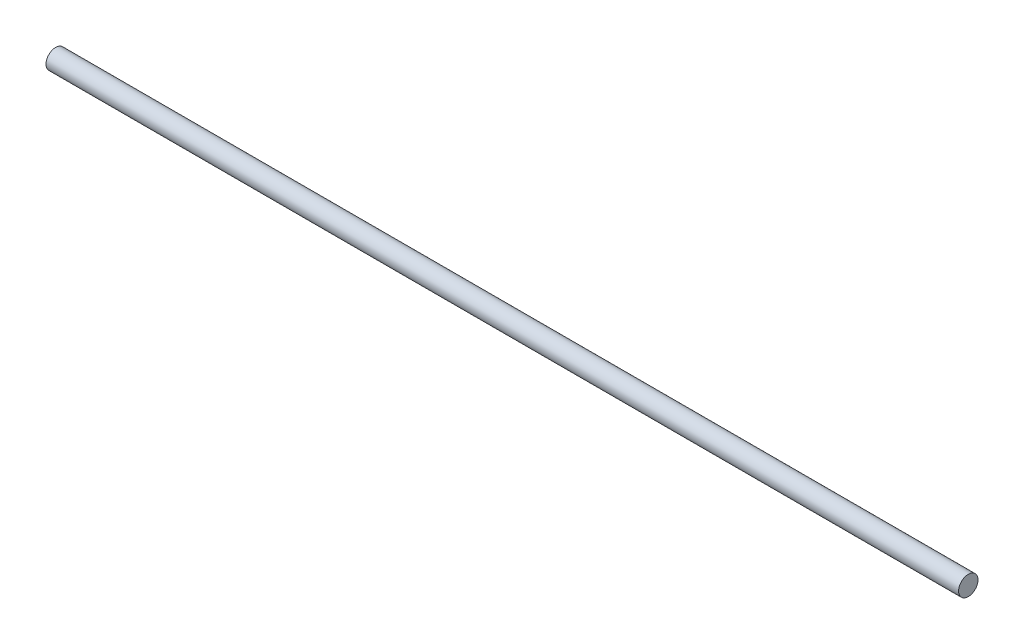
ISO-10303-21;
HEADER;
FILE_DESCRIPTION(('STEP AP214'),'2;1');
FILE_NAME('part.step','',(''),(''),'','','');
FILE_SCHEMA(('AUTOMOTIVE_DESIGN { 1 0 10303 214 1 1 1 1 }'));
ENDSEC;
DATA;
#1=APPLICATION_CONTEXT('core data for automotive mechanical design processes');
#2=APPLICATION_PROTOCOL_DEFINITION('international standard','automotive_design',2000,#1);
#3=PRODUCT_CONTEXT('',#1,'mechanical');
#4=PRODUCT('Part','Part','',(#3));
#5=PRODUCT_RELATED_PRODUCT_CATEGORY('part','',(#4));
#6=PRODUCT_DEFINITION_FORMATION('','',#4);
#7=PRODUCT_DEFINITION_CONTEXT('part definition',#1,'design');
#8=PRODUCT_DEFINITION('design','',#6,#7);
#9=PRODUCT_DEFINITION_SHAPE('','',#8);
#10=(LENGTH_UNIT() NAMED_UNIT(*) SI_UNIT(.MILLI.,.METRE.));
#11=(NAMED_UNIT(*) PLANE_ANGLE_UNIT() SI_UNIT($,.RADIAN.));
#12=(NAMED_UNIT(*) SI_UNIT($,.STERADIAN.) SOLID_ANGLE_UNIT());
#13=UNCERTAINTY_MEASURE_WITH_UNIT(LENGTH_MEASURE(1.E-05),#10,'distance_accuracy_value','');
#14=(GEOMETRIC_REPRESENTATION_CONTEXT(3) GLOBAL_UNCERTAINTY_ASSIGNED_CONTEXT((#13)) GLOBAL_UNIT_ASSIGNED_CONTEXT((#10,
#11,#12)) REPRESENTATION_CONTEXT('',''));
#15=CARTESIAN_POINT('',(0.,0.,0.));
#16=DIRECTION('',(0.,0.,1.));
#17=DIRECTION('',(1.,0.,0.));
#18=AXIS2_PLACEMENT_3D('',#15,#16,#17);
#19=CARTESIAN_POINT('',(596.9,0.,0.));
#20=DIRECTION('',(-1.,0.,0.));
#21=DIRECTION('',(0.,0.,1.));
#22=AXIS2_PLACEMENT_3D('',#19,#20,#21);
#23=CYLINDRICAL_SURFACE('',#22,6.35);
#24=CARTESIAN_POINT('',(596.9,0.,0.));
#25=DIRECTION('',(1.,0.,0.));
#26=DIRECTION('',(0.,0.,-1.));
#27=AXIS2_PLACEMENT_3D('',#24,#25,#26);
#28=CIRCLE('',#27,6.35);
#29=CARTESIAN_POINT('',(596.9,0.,-6.35));
#30=VERTEX_POINT('',#29);
#31=EDGE_CURVE('E10',#30,#30,#28,.T.);
#32=ORIENTED_EDGE('',*,*,#31,.F.);
#33=EDGE_LOOP('',(#32));
#34=FACE_BOUND('',#33,.T.);
#35=CARTESIAN_POINT('',(0.,0.,0.));
#36=DIRECTION('',(1.,0.,0.));
#37=DIRECTION('',(0.,0.,-1.));
#38=AXIS2_PLACEMENT_3D('',#35,#36,#37);
#39=CIRCLE('',#38,6.35);
#40=CARTESIAN_POINT('',(0.,0.,-6.35));
#41=VERTEX_POINT('',#40);
#42=EDGE_CURVE('E46',#41,#41,#39,.T.);
#43=ORIENTED_EDGE('',*,*,#42,.T.);
#44=EDGE_LOOP('',(#43));
#45=FACE_BOUND('',#44,.T.);
#46=ADVANCED_FACE('F43',(#34,#45),#23,.T.);
#47=CARTESIAN_POINT('',(596.9,0.,0.));
#48=DIRECTION('',(1.,0.,0.));
#49=DIRECTION('',(0.,0.,-1.));
#50=AXIS2_PLACEMENT_3D('',#47,#48,#49);
#51=PLANE('',#50);
#52=ORIENTED_EDGE('',*,*,#31,.T.);
#53=EDGE_LOOP('',(#52));
#54=FACE_BOUND('',#53,.T.);
#55=ADVANCED_FACE('F60',(#54),#51,.T.);
#56=CARTESIAN_POINT('',(0.,0.,0.));
#57=DIRECTION('',(1.,0.,0.));
#58=DIRECTION('',(0.,0.,-1.));
#59=AXIS2_PLACEMENT_3D('',#56,#57,#58);
#60=PLANE('',#59);
#61=ORIENTED_EDGE('',*,*,#42,.F.);
#62=EDGE_LOOP('',(#61));
#63=FACE_BOUND('',#62,.T.);
#64=ADVANCED_FACE('F58',(#63),#60,.F.);
#65=CLOSED_SHELL('',(#46,#55,#64));
#66=MANIFOLD_SOLID_BREP('B2',#65);
#67=ADVANCED_BREP_SHAPE_REPRESENTATION('',(#18,#66),#14);
#68=SHAPE_DEFINITION_REPRESENTATION(#9,#67);
ENDSEC;
END-ISO-10303-21;
